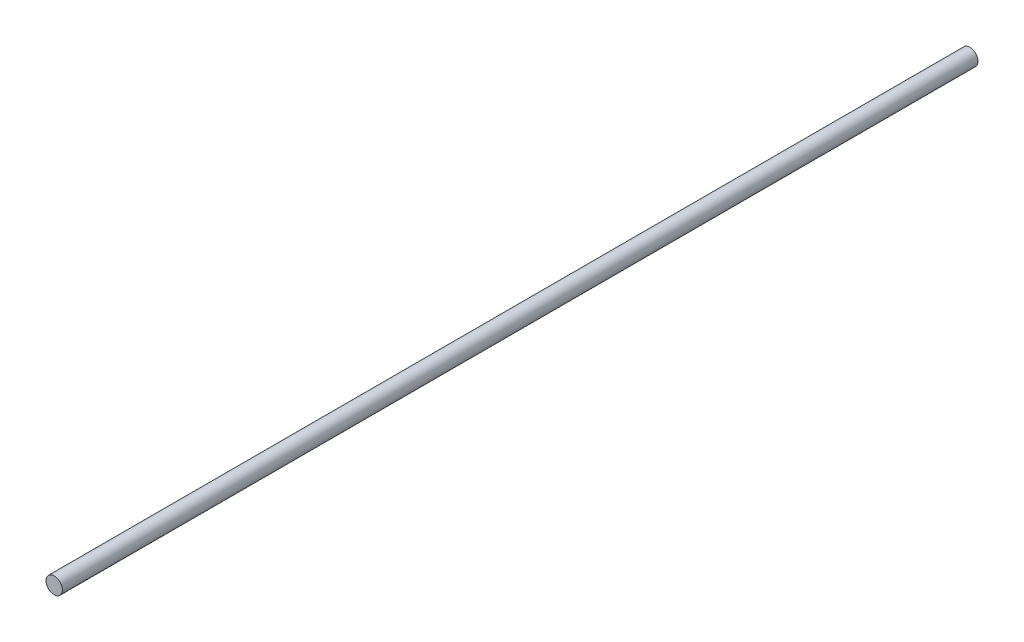
ISO-10303-21;
HEADER;
FILE_DESCRIPTION(('STEP AP214'),'2;1');
FILE_NAME('part.step','',(''),(''),'','','');
FILE_SCHEMA(('AUTOMOTIVE_DESIGN { 1 0 10303 214 1 1 1 1 }'));
ENDSEC;
DATA;
#1=APPLICATION_CONTEXT('core data for automotive mechanical design processes');
#2=APPLICATION_PROTOCOL_DEFINITION('international standard','automotive_design',2000,#1);
#3=PRODUCT_CONTEXT('',#1,'mechanical');
#4=PRODUCT('Part','Part','',(#3));
#5=PRODUCT_RELATED_PRODUCT_CATEGORY('part','',(#4));
#6=PRODUCT_DEFINITION_FORMATION('','',#4);
#7=PRODUCT_DEFINITION_CONTEXT('part definition',#1,'design');
#8=PRODUCT_DEFINITION('design','',#6,#7);
#9=PRODUCT_DEFINITION_SHAPE('','',#8);
#10=(LENGTH_UNIT() NAMED_UNIT(*) SI_UNIT(.MILLI.,.METRE.));
#11=(NAMED_UNIT(*) PLANE_ANGLE_UNIT() SI_UNIT($,.RADIAN.));
#12=(NAMED_UNIT(*) SI_UNIT($,.STERADIAN.) SOLID_ANGLE_UNIT());
#13=UNCERTAINTY_MEASURE_WITH_UNIT(LENGTH_MEASURE(1.E-05),#10,'distance_accuracy_value','');
#14=(GEOMETRIC_REPRESENTATION_CONTEXT(3) GLOBAL_UNCERTAINTY_ASSIGNED_CONTEXT((#13)) GLOBAL_UNIT_ASSIGNED_CONTEXT((#10,
#11,#12)) REPRESENTATION_CONTEXT('',''));
#15=CARTESIAN_POINT('',(0.,0.,0.));
#16=DIRECTION('',(0.,0.,1.));
#17=DIRECTION('',(1.,0.,0.));
#18=AXIS2_PLACEMENT_3D('',#15,#16,#17);
#19=CARTESIAN_POINT('',(0.,0.,355.6));
#20=DIRECTION('',(0.,0.,-1.));
#21=DIRECTION('',(-1.,0.,0.));
#22=AXIS2_PLACEMENT_3D('',#19,#20,#21);
#23=CYLINDRICAL_SURFACE('',#22,3.17499999999998);
#24=CARTESIAN_POINT('',(0.,0.,355.6));
#25=DIRECTION('',(0.,0.,1.));
#26=DIRECTION('',(1.,0.,0.));
#27=AXIS2_PLACEMENT_3D('',#24,#25,#26);
#28=CIRCLE('',#27,3.17499999999998);
#29=CARTESIAN_POINT('',(3.17499999999998,0.,355.6));
#30=VERTEX_POINT('',#29);
#31=EDGE_CURVE('E10',#30,#30,#28,.T.);
#32=ORIENTED_EDGE('',*,*,#31,.F.);
#33=EDGE_LOOP('',(#32));
#34=FACE_BOUND('',#33,.T.);
#35=CARTESIAN_POINT('',(0.,0.,0.));
#36=DIRECTION('',(0.,0.,1.));
#37=DIRECTION('',(1.,0.,0.));
#38=AXIS2_PLACEMENT_3D('',#35,#36,#37);
#39=CIRCLE('',#38,3.17499999999998);
#40=CARTESIAN_POINT('',(3.17499999999998,0.,0.));
#41=VERTEX_POINT('',#40);
#42=EDGE_CURVE('E44',#41,#41,#39,.T.);
#43=ORIENTED_EDGE('',*,*,#42,.T.);
#44=EDGE_LOOP('',(#43));
#45=FACE_BOUND('',#44,.T.);
#46=ADVANCED_FACE('F41',(#34,#45),#23,.T.);
#47=CARTESIAN_POINT('',(0.,0.,355.6));
#48=DIRECTION('',(0.,0.,1.));
#49=DIRECTION('',(1.,0.,0.));
#50=AXIS2_PLACEMENT_3D('',#47,#48,#49);
#51=PLANE('',#50);
#52=ORIENTED_EDGE('',*,*,#31,.T.);
#53=EDGE_LOOP('',(#52));
#54=FACE_BOUND('',#53,.T.);
#55=ADVANCED_FACE('F58',(#54),#51,.T.);
#56=CARTESIAN_POINT('',(0.,0.,0.));
#57=DIRECTION('',(0.,0.,1.));
#58=DIRECTION('',(1.,0.,0.));
#59=AXIS2_PLACEMENT_3D('',#56,#57,#58);
#60=PLANE('',#59);
#61=ORIENTED_EDGE('',*,*,#42,.F.);
#62=EDGE_LOOP('',(#61));
#63=FACE_BOUND('',#62,.T.);
#64=ADVANCED_FACE('F56',(#63),#60,.F.);
#65=CLOSED_SHELL('',(#46,#55,#64));
#66=MANIFOLD_SOLID_BREP('B2',#65);
#67=ADVANCED_BREP_SHAPE_REPRESENTATION('',(#18,#66),#14);
#68=SHAPE_DEFINITION_REPRESENTATION(#9,#67);
ENDSEC;
END-ISO-10303-21;
